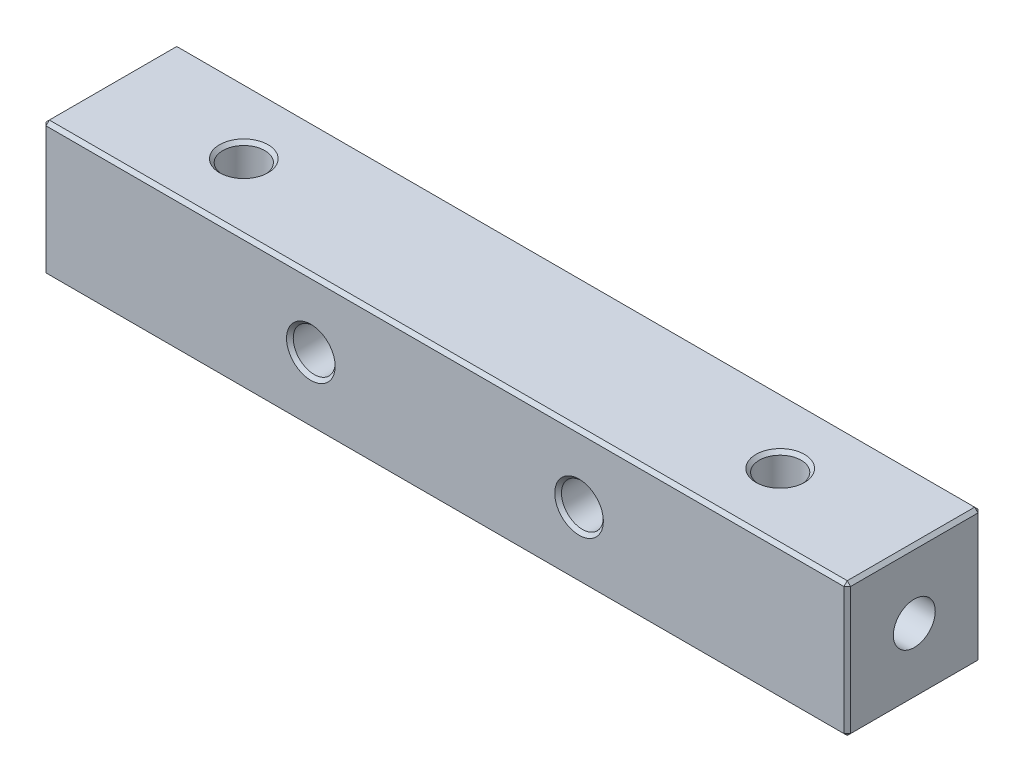
ISO-10303-21;
HEADER;
FILE_DESCRIPTION(('STEP AP214'),'2;1');
FILE_NAME('part.step','',(''),(''),'','','');
FILE_SCHEMA(('AUTOMOTIVE_DESIGN { 1 0 10303 214 1 1 1 1 }'));
ENDSEC;
DATA;
#1=APPLICATION_CONTEXT('core data for automotive mechanical design processes');
#2=APPLICATION_PROTOCOL_DEFINITION('international standard','automotive_design',2000,#1);
#3=PRODUCT_CONTEXT('',#1,'mechanical');
#4=PRODUCT('Part','Part','',(#3));
#5=PRODUCT_RELATED_PRODUCT_CATEGORY('part','',(#4));
#6=PRODUCT_DEFINITION_FORMATION('','',#4);
#7=PRODUCT_DEFINITION_CONTEXT('part definition',#1,'design');
#8=PRODUCT_DEFINITION('design','',#6,#7);
#9=PRODUCT_DEFINITION_SHAPE('','',#8);
#10=(LENGTH_UNIT() NAMED_UNIT(*) SI_UNIT(.MILLI.,.METRE.));
#11=(NAMED_UNIT(*) PLANE_ANGLE_UNIT() SI_UNIT($,.RADIAN.));
#12=(NAMED_UNIT(*) SI_UNIT($,.STERADIAN.) SOLID_ANGLE_UNIT());
#13=UNCERTAINTY_MEASURE_WITH_UNIT(LENGTH_MEASURE(1.E-05),#10,'distance_accuracy_value','');
#14=(GEOMETRIC_REPRESENTATION_CONTEXT(3) GLOBAL_UNCERTAINTY_ASSIGNED_CONTEXT((#13)) GLOBAL_UNIT_ASSIGNED_CONTEXT((#10,
#11,#12)) REPRESENTATION_CONTEXT('',''));
#15=CARTESIAN_POINT('',(0.,0.,0.));
#16=DIRECTION('',(0.,0.,1.));
#17=DIRECTION('',(1.,0.,0.));
#18=AXIS2_PLACEMENT_3D('',#15,#16,#17);
#19=CARTESIAN_POINT('',(-24.,4.,-4.));
#20=DIRECTION('',(1.,0.,0.));
#21=DIRECTION('',(0.,0.,-1.));
#22=AXIS2_PLACEMENT_3D('',#19,#20,#21);
#23=PLANE('',#22);
#24=DIRECTION('',(0.,-1.,0.));
#25=VECTOR('',#24,1.);
#26=CARTESIAN_POINT('',(-24.,4.,-3.79999999999999));
#27=LINE('',#26,#25);
#28=CARTESIAN_POINT('',(-24.,3.79999999999999,-3.79999999999999));
#29=VERTEX_POINT('',#28);
#30=CARTESIAN_POINT('',(-24.,-3.79999999999999,-3.79999999999999));
#31=VERTEX_POINT('',#30);
#32=EDGE_CURVE('E208',#29,#31,#27,.T.);
#33=ORIENTED_EDGE('',*,*,#32,.T.);
#34=DIRECTION('',(0.,0.,1.));
#35=VECTOR('',#34,1.);
#36=CARTESIAN_POINT('',(-24.,-3.79999999999999,-4.));
#37=LINE('',#36,#35);
#38=CARTESIAN_POINT('',(-24.,-3.79999999999999,3.79999999999999));
#39=VERTEX_POINT('',#38);
#40=EDGE_CURVE('E214',#31,#39,#37,.T.);
#41=ORIENTED_EDGE('',*,*,#40,.T.);
#42=DIRECTION('',(0.,1.,0.));
#43=VECTOR('',#42,1.);
#44=CARTESIAN_POINT('',(-24.,4.,3.79999999999999));
#45=LINE('',#44,#43);
#46=CARTESIAN_POINT('',(-24.,3.79999999999999,3.79999999999999));
#47=VERTEX_POINT('',#46);
#48=EDGE_CURVE('E212',#39,#47,#45,.T.);
#49=ORIENTED_EDGE('',*,*,#48,.T.);
#50=DIRECTION('',(0.,0.,-1.));
#51=VECTOR('',#50,1.);
#52=CARTESIAN_POINT('',(-24.,3.79999999999999,-4.));
#53=LINE('',#52,#51);
#54=EDGE_CURVE('E210',#47,#29,#53,.T.);
#55=ORIENTED_EDGE('',*,*,#54,.T.);
#56=EDGE_LOOP('',(#33,#41,#49,#55));
#57=FACE_BOUND('',#56,.T.);
#58=CARTESIAN_POINT('',(-24.,0.,0.));
#59=DIRECTION('',(-1.,0.,0.));
#60=DIRECTION('',(0.,0.,1.));
#61=AXIS2_PLACEMENT_3D('',#58,#59,#60);
#62=CIRCLE('',#61,1.25);
#63=CARTESIAN_POINT('',(-24.,0.,1.25));
#64=VERTEX_POINT('',#63);
#65=EDGE_CURVE('E245',#64,#64,#62,.T.);
#66=ORIENTED_EDGE('',*,*,#65,.F.);
#67=EDGE_LOOP('',(#66));
#68=FACE_BOUND('',#67,.T.);
#69=ADVANCED_FACE('F38',(#57,#68),#23,.F.);
#70=CARTESIAN_POINT('',(24.,4.,-4.));
#71=DIRECTION('',(-1.,0.,0.));
#72=DIRECTION('',(0.,0.,1.));
#73=AXIS2_PLACEMENT_3D('',#70,#71,#72);
#74=PLANE('',#73);
#75=CARTESIAN_POINT('',(24.,0.,0.));
#76=DIRECTION('',(1.,0.,0.));
#77=DIRECTION('',(0.,0.,-1.));
#78=AXIS2_PLACEMENT_3D('',#75,#76,#77);
#79=CIRCLE('',#78,1.24999999999999);
#80=CARTESIAN_POINT('',(24.,0.,-1.24999999999999));
#81=VERTEX_POINT('',#80);
#82=EDGE_CURVE('E321',#81,#81,#79,.T.);
#83=ORIENTED_EDGE('',*,*,#82,.F.);
#84=EDGE_LOOP('',(#83));
#85=FACE_BOUND('',#84,.T.);
#86=DIRECTION('',(0.,-1.,0.));
#87=VECTOR('',#86,1.);
#88=CARTESIAN_POINT('',(24.,4.,3.79999999999999));
#89=LINE('',#88,#87);
#90=CARTESIAN_POINT('',(24.,3.79999999999999,3.79999999999999));
#91=VERTEX_POINT('',#90);
#92=CARTESIAN_POINT('',(24.,-3.79999999999999,3.79999999999999));
#93=VERTEX_POINT('',#92);
#94=EDGE_CURVE('E221',#91,#93,#89,.T.);
#95=ORIENTED_EDGE('',*,*,#94,.T.);
#96=DIRECTION('',(0.,0.,-1.));
#97=VECTOR('',#96,1.);
#98=CARTESIAN_POINT('',(24.,-3.79999999999999,-4.));
#99=LINE('',#98,#97);
#100=CARTESIAN_POINT('',(24.,-3.79999999999999,-3.79999999999999));
#101=VERTEX_POINT('',#100);
#102=EDGE_CURVE('E223',#93,#101,#99,.T.);
#103=ORIENTED_EDGE('',*,*,#102,.T.);
#104=DIRECTION('',(0.,1.,0.));
#105=VECTOR('',#104,1.);
#106=CARTESIAN_POINT('',(24.,4.,-3.79999999999999));
#107=LINE('',#106,#105);
#108=CARTESIAN_POINT('',(24.,3.79999999999999,-3.79999999999999));
#109=VERTEX_POINT('',#108);
#110=EDGE_CURVE('E217',#101,#109,#107,.T.);
#111=ORIENTED_EDGE('',*,*,#110,.T.);
#112=DIRECTION('',(0.,0.,1.));
#113=VECTOR('',#112,1.);
#114=CARTESIAN_POINT('',(24.,3.79999999999999,4.));
#115=LINE('',#114,#113);
#116=EDGE_CURVE('E219',#109,#91,#115,.T.);
#117=ORIENTED_EDGE('',*,*,#116,.T.);
#118=EDGE_LOOP('',(#95,#103,#111,#117));
#119=FACE_BOUND('',#118,.T.);
#120=ADVANCED_FACE('F357',(#85,#119),#74,.F.);
#121=CARTESIAN_POINT('',(-24.,4.,-4.));
#122=DIRECTION('',(0.,0.,1.));
#123=DIRECTION('',(1.,0.,0.));
#124=AXIS2_PLACEMENT_3D('',#121,#122,#123);
#125=PLANE('',#124);
#126=DIRECTION('',(1.,0.,0.));
#127=VECTOR('',#126,1.);
#128=CARTESIAN_POINT('',(24.,3.79999999999999,-4.));
#129=LINE('',#128,#127);
#130=CARTESIAN_POINT('',(-23.8,3.79999999999999,-4.));
#131=VERTEX_POINT('',#130);
#132=CARTESIAN_POINT('',(23.8,3.79999999999999,-4.));
#133=VERTEX_POINT('',#132);
#134=EDGE_CURVE('E236',#131,#133,#129,.T.);
#135=ORIENTED_EDGE('',*,*,#134,.T.);
#136=DIRECTION('',(0.,-1.,0.));
#137=VECTOR('',#136,1.);
#138=CARTESIAN_POINT('',(23.8,4.,-4.));
#139=LINE('',#138,#137);
#140=CARTESIAN_POINT('',(23.8,-3.79999999999999,-4.));
#141=VERTEX_POINT('',#140);
#142=EDGE_CURVE('E238',#133,#141,#139,.T.);
#143=ORIENTED_EDGE('',*,*,#142,.T.);
#144=DIRECTION('',(-1.,0.,0.));
#145=VECTOR('',#144,1.);
#146=CARTESIAN_POINT('',(-24.,-3.79999999999999,-4.));
#147=LINE('',#146,#145);
#148=CARTESIAN_POINT('',(-23.8,-3.79999999999999,-4.));
#149=VERTEX_POINT('',#148);
#150=EDGE_CURVE('E232',#141,#149,#147,.T.);
#151=ORIENTED_EDGE('',*,*,#150,.T.);
#152=DIRECTION('',(0.,1.,0.));
#153=VECTOR('',#152,1.);
#154=CARTESIAN_POINT('',(-23.8,4.,-4.));
#155=LINE('',#154,#153);
#156=EDGE_CURVE('E234',#149,#131,#155,.T.);
#157=ORIENTED_EDGE('',*,*,#156,.T.);
#158=EDGE_LOOP('',(#135,#143,#151,#157));
#159=FACE_BOUND('',#158,.T.);
#160=CARTESIAN_POINT('',(-8.,0.,-4.));
#161=DIRECTION('',(0.,0.,1.));
#162=DIRECTION('',(1.,0.,0.));
#163=AXIS2_PLACEMENT_3D('',#160,#161,#162);
#164=CIRCLE('',#163,1.44999999999997);
#165=CARTESIAN_POINT('',(-6.55000000000003,0.,-4.));
#166=VERTEX_POINT('',#165);
#167=EDGE_CURVE('E229',#166,#166,#164,.T.);
#168=ORIENTED_EDGE('',*,*,#167,.T.);
#169=EDGE_LOOP('',(#168));
#170=FACE_BOUND('',#169,.T.);
#171=CARTESIAN_POINT('',(8.,0.,-4.));
#172=DIRECTION('',(0.,0.,1.));
#173=DIRECTION('',(1.,0.,0.));
#174=AXIS2_PLACEMENT_3D('',#171,#172,#173);
#175=CIRCLE('',#174,1.44999999999997);
#176=CARTESIAN_POINT('',(9.44999999999997,0.,-4.));
#177=VERTEX_POINT('',#176);
#178=EDGE_CURVE('E226',#177,#177,#175,.T.);
#179=ORIENTED_EDGE('',*,*,#178,.T.);
#180=EDGE_LOOP('',(#179));
#181=FACE_BOUND('',#180,.T.);
#182=ADVANCED_FACE('F363',(#159,#170,#181),#125,.F.);
#183=CARTESIAN_POINT('',(-24.,4.,4.));
#184=DIRECTION('',(0.,0.,-1.));
#185=DIRECTION('',(-1.,0.,0.));
#186=AXIS2_PLACEMENT_3D('',#183,#184,#185);
#187=PLANE('',#186);
#188=CARTESIAN_POINT('',(-8.,0.,4.));
#189=DIRECTION('',(0.,0.,-1.));
#190=DIRECTION('',(-1.,0.,0.));
#191=AXIS2_PLACEMENT_3D('',#188,#189,#190);
#192=CIRCLE('',#191,1.45);
#193=CARTESIAN_POINT('',(-9.45,0.,4.));
#194=VERTEX_POINT('',#193);
#195=EDGE_CURVE('E178',#194,#194,#192,.T.);
#196=ORIENTED_EDGE('',*,*,#195,.T.);
#197=EDGE_LOOP('',(#196));
#198=FACE_BOUND('',#197,.T.);
#199=CARTESIAN_POINT('',(8.,0.,4.));
#200=DIRECTION('',(0.,0.,-1.));
#201=DIRECTION('',(-1.,0.,0.));
#202=AXIS2_PLACEMENT_3D('',#199,#200,#201);
#203=CIRCLE('',#202,1.45);
#204=CARTESIAN_POINT('',(9.45,0.,4.));
#205=VERTEX_POINT('',#204);
#206=EDGE_CURVE('E175',#205,#205,#203,.T.);
#207=ORIENTED_EDGE('',*,*,#206,.T.);
#208=EDGE_LOOP('',(#207));
#209=FACE_BOUND('',#208,.T.);
#210=DIRECTION('',(-1.,0.,0.));
#211=VECTOR('',#210,1.);
#212=CARTESIAN_POINT('',(-24.,3.79999999999999,4.));
#213=LINE('',#212,#211);
#214=CARTESIAN_POINT('',(23.8,3.79999999999999,4.));
#215=VERTEX_POINT('',#214);
#216=CARTESIAN_POINT('',(-23.8,3.79999999999999,4.));
#217=VERTEX_POINT('',#216);
#218=EDGE_CURVE('E166',#215,#217,#213,.T.);
#219=ORIENTED_EDGE('',*,*,#218,.T.);
#220=DIRECTION('',(0.,-1.,0.));
#221=VECTOR('',#220,1.);
#222=CARTESIAN_POINT('',(-23.8,4.,4.));
#223=LINE('',#222,#221);
#224=CARTESIAN_POINT('',(-23.8,-3.79999999999999,4.));
#225=VERTEX_POINT('',#224);
#226=EDGE_CURVE('E172',#217,#225,#223,.T.);
#227=ORIENTED_EDGE('',*,*,#226,.T.);
#228=DIRECTION('',(1.,0.,0.));
#229=VECTOR('',#228,1.);
#230=CARTESIAN_POINT('',(-24.,-3.79999999999999,4.));
#231=LINE('',#230,#229);
#232=CARTESIAN_POINT('',(23.8,-3.79999999999999,4.));
#233=VERTEX_POINT('',#232);
#234=EDGE_CURVE('E170',#225,#233,#231,.T.);
#235=ORIENTED_EDGE('',*,*,#234,.T.);
#236=DIRECTION('',(0.,1.,0.));
#237=VECTOR('',#236,1.);
#238=CARTESIAN_POINT('',(23.8,4.,4.));
#239=LINE('',#238,#237);
#240=EDGE_CURVE('E168',#233,#215,#239,.T.);
#241=ORIENTED_EDGE('',*,*,#240,.T.);
#242=EDGE_LOOP('',(#219,#227,#235,#241));
#243=FACE_BOUND('',#242,.T.);
#244=ADVANCED_FACE('F368',(#198,#209,#243),#187,.F.);
#245=CARTESIAN_POINT('',(0.,4.,0.));
#246=DIRECTION('',(0.,1.,0.));
#247=DIRECTION('',(0.,0.,1.));
#248=AXIS2_PLACEMENT_3D('',#245,#246,#247);
#249=PLANE('',#248);
#250=CARTESIAN_POINT('',(16.,4.,0.));
#251=DIRECTION('',(0.,1.,0.));
#252=DIRECTION('',(0.,0.,1.));
#253=AXIS2_PLACEMENT_3D('',#250,#251,#252);
#254=CIRCLE('',#253,1.44999999999997);
#255=CARTESIAN_POINT('',(16.,4.,1.44999999999997));
#256=VERTEX_POINT('',#255);
#257=EDGE_CURVE('E205',#256,#256,#254,.F.);
#258=ORIENTED_EDGE('',*,*,#257,.T.);
#259=EDGE_LOOP('',(#258));
#260=FACE_BOUND('',#259,.T.);
#261=CARTESIAN_POINT('',(-16.,4.,0.));
#262=DIRECTION('',(0.,1.,0.));
#263=DIRECTION('',(0.,0.,1.));
#264=AXIS2_PLACEMENT_3D('',#261,#262,#263);
#265=CIRCLE('',#264,1.44999999999997);
#266=CARTESIAN_POINT('',(-16.,4.,1.44999999999997));
#267=VERTEX_POINT('',#266);
#268=EDGE_CURVE('E202',#267,#267,#265,.F.);
#269=ORIENTED_EDGE('',*,*,#268,.T.);
#270=EDGE_LOOP('',(#269));
#271=FACE_BOUND('',#270,.T.);
#272=DIRECTION('',(0.,0.,1.));
#273=VECTOR('',#272,1.);
#274=CARTESIAN_POINT('',(-23.8,4.,4.));
#275=LINE('',#274,#273);
#276=CARTESIAN_POINT('',(-23.8,4.,-3.79999999999999));
#277=VERTEX_POINT('',#276);
#278=CARTESIAN_POINT('',(-23.8,4.,3.79999999999999));
#279=VERTEX_POINT('',#278);
#280=EDGE_CURVE('E197',#277,#279,#275,.T.);
#281=ORIENTED_EDGE('',*,*,#280,.T.);
#282=DIRECTION('',(1.,0.,0.));
#283=VECTOR('',#282,1.);
#284=CARTESIAN_POINT('',(24.,4.,3.79999999999999));
#285=LINE('',#284,#283);
#286=CARTESIAN_POINT('',(23.8,4.,3.79999999999999));
#287=VERTEX_POINT('',#286);
#288=EDGE_CURVE('E199',#279,#287,#285,.T.);
#289=ORIENTED_EDGE('',*,*,#288,.T.);
#290=DIRECTION('',(0.,0.,-1.));
#291=VECTOR('',#290,1.);
#292=CARTESIAN_POINT('',(23.8,4.,-4.));
#293=LINE('',#292,#291);
#294=CARTESIAN_POINT('',(23.8,4.,-3.79999999999999));
#295=VERTEX_POINT('',#294);
#296=EDGE_CURVE('E195',#287,#295,#293,.T.);
#297=ORIENTED_EDGE('',*,*,#296,.T.);
#298=DIRECTION('',(-1.,0.,0.));
#299=VECTOR('',#298,1.);
#300=CARTESIAN_POINT('',(-24.,4.,-3.79999999999999));
#301=LINE('',#300,#299);
#302=EDGE_CURVE('E193',#295,#277,#301,.T.);
#303=ORIENTED_EDGE('',*,*,#302,.T.);
#304=EDGE_LOOP('',(#281,#289,#297,#303));
#305=FACE_BOUND('',#304,.T.);
#306=ADVANCED_FACE('F524',(#260,#271,#305),#249,.T.);
#307=CARTESIAN_POINT('',(0.,-4.,0.));
#308=DIRECTION('',(0.,1.,0.));
#309=DIRECTION('',(0.,0.,1.));
#310=AXIS2_PLACEMENT_3D('',#307,#308,#309);
#311=PLANE('',#310);
#312=CARTESIAN_POINT('',(16.,-4.,0.));
#313=DIRECTION('',(0.,1.,0.));
#314=DIRECTION('',(0.,0.,1.));
#315=AXIS2_PLACEMENT_3D('',#312,#313,#314);
#316=CIRCLE('',#315,1.45);
#317=CARTESIAN_POINT('',(16.,-4.,1.45));
#318=VERTEX_POINT('',#317);
#319=EDGE_CURVE('E152',#318,#318,#316,.T.);
#320=ORIENTED_EDGE('',*,*,#319,.T.);
#321=EDGE_LOOP('',(#320));
#322=FACE_BOUND('',#321,.T.);
#323=CARTESIAN_POINT('',(-16.,-4.,0.));
#324=DIRECTION('',(0.,1.,0.));
#325=DIRECTION('',(0.,0.,1.));
#326=AXIS2_PLACEMENT_3D('',#323,#324,#325);
#327=CIRCLE('',#326,1.45);
#328=CARTESIAN_POINT('',(-16.,-4.,1.45));
#329=VERTEX_POINT('',#328);
#330=EDGE_CURVE('E157',#329,#329,#327,.T.);
#331=ORIENTED_EDGE('',*,*,#330,.T.);
#332=EDGE_LOOP('',(#331));
#333=FACE_BOUND('',#332,.T.);
#334=DIRECTION('',(0.,0.,1.));
#335=VECTOR('',#334,1.);
#336=CARTESIAN_POINT('',(23.8,-4.,0.));
#337=LINE('',#336,#335);
#338=CARTESIAN_POINT('',(23.8,-4.,-3.79999999999999));
#339=VERTEX_POINT('',#338);
#340=CARTESIAN_POINT('',(23.8,-4.,3.79999999999999));
#341=VERTEX_POINT('',#340);
#342=EDGE_CURVE('E327',#339,#341,#337,.T.);
#343=ORIENTED_EDGE('',*,*,#342,.T.);
#344=DIRECTION('',(-1.,0.,0.));
#345=VECTOR('',#344,1.);
#346=CARTESIAN_POINT('',(0.,-4.,3.79999999999999));
#347=LINE('',#346,#345);
#348=CARTESIAN_POINT('',(-23.8,-4.,3.79999999999999));
#349=VERTEX_POINT('',#348);
#350=EDGE_CURVE('E332',#341,#349,#347,.T.);
#351=ORIENTED_EDGE('',*,*,#350,.T.);
#352=DIRECTION('',(0.,0.,-1.));
#353=VECTOR('',#352,1.);
#354=CARTESIAN_POINT('',(-23.8,-4.,0.));
#355=LINE('',#354,#353);
#356=CARTESIAN_POINT('',(-23.8,-4.,-3.79999999999999));
#357=VERTEX_POINT('',#356);
#358=EDGE_CURVE('E329',#349,#357,#355,.T.);
#359=ORIENTED_EDGE('',*,*,#358,.T.);
#360=DIRECTION('',(1.,0.,0.));
#361=VECTOR('',#360,1.);
#362=CARTESIAN_POINT('',(0.,-4.,-3.79999999999999));
#363=LINE('',#362,#361);
#364=EDGE_CURVE('E310',#357,#339,#363,.T.);
#365=ORIENTED_EDGE('',*,*,#364,.T.);
#366=EDGE_LOOP('',(#343,#351,#359,#365));
#367=FACE_BOUND('',#366,.T.);
#368=ADVANCED_FACE('F142',(#322,#333,#367),#311,.F.);
#369=CARTESIAN_POINT('',(16.,4.,0.));
#370=DIRECTION('',(0.,1.,0.));
#371=DIRECTION('',(0.,0.,1.));
#372=AXIS2_PLACEMENT_3D('',#369,#370,#371);
#373=CYLINDRICAL_SURFACE('',#372,1.24999999999999);
#374=CARTESIAN_POINT('',(16.,0.,0.));
#375=DIRECTION('',(-0.707106781186547,0.707106781186547,0.));
#376=DIRECTION('',(0.707106781186547,0.707106781186547,0.));
#377=AXIS2_PLACEMENT_3D('',#374,#375,#376);
#378=ELLIPSE('',#377,1.76776695296636,1.24999999999999);
#379=CARTESIAN_POINT('',(16.,0.,-1.25));
#380=VERTEX_POINT('',#379);
#381=CARTESIAN_POINT('',(16.,0.,1.24999999999999));
#382=VERTEX_POINT('',#381);
#383=EDGE_CURVE('E47',#380,#382,#378,.F.);
#384=ORIENTED_EDGE('',*,*,#383,.T.);
#385=CARTESIAN_POINT('',(16.,0.,0.));
#386=DIRECTION('',(0.707106781186547,0.707106781186547,0.));
#387=DIRECTION('',(-0.707106781186547,0.707106781186547,0.));
#388=AXIS2_PLACEMENT_3D('',#385,#386,#387);
#389=ELLIPSE('',#388,1.76776695296636,1.24999999999999);
#390=EDGE_CURVE('E11',#382,#380,#389,.T.);
#391=ORIENTED_EDGE('',*,*,#390,.T.);
#392=EDGE_LOOP('',(#384,#391));
#393=FACE_BOUND('',#392,.T.);
#394=CARTESIAN_POINT('',(16.,-3.8,0.));
#395=DIRECTION('',(0.,1.,0.));
#396=DIRECTION('',(0.,0.,1.));
#397=AXIS2_PLACEMENT_3D('',#394,#395,#396);
#398=CIRCLE('',#397,1.24999999999999);
#399=CARTESIAN_POINT('',(16.,-3.8,1.24999999999999));
#400=VERTEX_POINT('',#399);
#401=EDGE_CURVE('E147',#400,#400,#398,.F.);
#402=ORIENTED_EDGE('',*,*,#401,.T.);
#403=EDGE_LOOP('',(#402));
#404=FACE_BOUND('',#403,.T.);
#405=CARTESIAN_POINT('',(16.,3.80000000000002,0.));
#406=DIRECTION('',(0.,1.,0.));
#407=DIRECTION('',(0.,0.,1.));
#408=AXIS2_PLACEMENT_3D('',#405,#406,#407);
#409=CIRCLE('',#408,1.24999999999999);
#410=CARTESIAN_POINT('',(16.,3.80000000000002,1.24999999999999));
#411=VERTEX_POINT('',#410);
#412=EDGE_CURVE('E150',#411,#411,#409,.T.);
#413=ORIENTED_EDGE('',*,*,#412,.T.);
#414=EDGE_LOOP('',(#413));
#415=FACE_BOUND('',#414,.T.);
#416=ADVANCED_FACE('F138',(#393,#404,#415),#373,.F.);
#417=CARTESIAN_POINT('',(-16.,4.,0.));
#418=DIRECTION('',(0.,1.,0.));
#419=DIRECTION('',(0.,0.,1.));
#420=AXIS2_PLACEMENT_3D('',#417,#418,#419);
#421=CYLINDRICAL_SURFACE('',#420,1.24999999999999);
#422=CARTESIAN_POINT('',(-16.,0.,0.));
#423=DIRECTION('',(0.707106781186547,0.707106781186547,0.));
#424=DIRECTION('',(-0.707106781186547,0.707106781186547,0.));
#425=AXIS2_PLACEMENT_3D('',#422,#423,#424);
#426=ELLIPSE('',#425,1.76776695296636,1.25);
#427=CARTESIAN_POINT('',(-16.,0.,1.25));
#428=VERTEX_POINT('',#427);
#429=CARTESIAN_POINT('',(-16.,0.,-1.24999999999999));
#430=VERTEX_POINT('',#429);
#431=EDGE_CURVE('E241',#428,#430,#426,.F.);
#432=ORIENTED_EDGE('',*,*,#431,.T.);
#433=CARTESIAN_POINT('',(-16.,0.,0.));
#434=DIRECTION('',(-0.707106781186547,0.707106781186547,0.));
#435=DIRECTION('',(0.707106781186547,0.707106781186547,0.));
#436=AXIS2_PLACEMENT_3D('',#433,#434,#435);
#437=ELLIPSE('',#436,1.76776695296636,1.25);
#438=EDGE_CURVE('E58',#430,#428,#437,.T.);
#439=ORIENTED_EDGE('',*,*,#438,.T.);
#440=EDGE_LOOP('',(#432,#439));
#441=FACE_BOUND('',#440,.T.);
#442=CARTESIAN_POINT('',(-16.,-3.8,0.));
#443=DIRECTION('',(0.,1.,0.));
#444=DIRECTION('',(0.,0.,1.));
#445=AXIS2_PLACEMENT_3D('',#442,#443,#444);
#446=CIRCLE('',#445,1.24999999999999);
#447=CARTESIAN_POINT('',(-16.,-3.8,1.24999999999999));
#448=VERTEX_POINT('',#447);
#449=EDGE_CURVE('E163',#448,#448,#446,.F.);
#450=ORIENTED_EDGE('',*,*,#449,.T.);
#451=EDGE_LOOP('',(#450));
#452=FACE_BOUND('',#451,.T.);
#453=CARTESIAN_POINT('',(-16.,3.80000000000002,0.));
#454=DIRECTION('',(0.,1.,0.));
#455=DIRECTION('',(0.,0.,1.));
#456=AXIS2_PLACEMENT_3D('',#453,#454,#455);
#457=CIRCLE('',#456,1.24999999999999);
#458=CARTESIAN_POINT('',(-16.,3.80000000000002,1.24999999999999));
#459=VERTEX_POINT('',#458);
#460=EDGE_CURVE('E154',#459,#459,#457,.T.);
#461=ORIENTED_EDGE('',*,*,#460,.T.);
#462=EDGE_LOOP('',(#461));
#463=FACE_BOUND('',#462,.T.);
#464=ADVANCED_FACE('F141',(#441,#452,#463),#421,.F.);
#465=CARTESIAN_POINT('',(-8.,0.,-4.));
#466=DIRECTION('',(0.,0.,-1.));
#467=DIRECTION('',(-1.,0.,0.));
#468=AXIS2_PLACEMENT_3D('',#465,#466,#467);
#469=CYLINDRICAL_SURFACE('',#468,1.24999999999999);
#470=CARTESIAN_POINT('',(-8.,0.,3.79999999999999));
#471=DIRECTION('',(0.,0.,-1.));
#472=DIRECTION('',(-1.,0.,0.));
#473=AXIS2_PLACEMENT_3D('',#470,#471,#472);
#474=CIRCLE('',#473,1.24999999999999);
#475=CARTESIAN_POINT('',(-9.24999999999999,0.,3.79999999999999));
#476=VERTEX_POINT('',#475);
#477=EDGE_CURVE('E184',#476,#476,#474,.F.);
#478=ORIENTED_EDGE('',*,*,#477,.T.);
#479=EDGE_LOOP('',(#478));
#480=FACE_BOUND('',#479,.T.);
#481=CARTESIAN_POINT('',(-8.,0.,-3.80000000000002));
#482=DIRECTION('',(0.,0.,1.));
#483=DIRECTION('',(1.,0.,0.));
#484=AXIS2_PLACEMENT_3D('',#481,#482,#483);
#485=CIRCLE('',#484,1.24999999999999);
#486=CARTESIAN_POINT('',(-6.75000000000001,0.,-3.80000000000002));
#487=VERTEX_POINT('',#486);
#488=EDGE_CURVE('E181',#487,#487,#485,.F.);
#489=ORIENTED_EDGE('',*,*,#488,.T.);
#490=EDGE_LOOP('',(#489));
#491=FACE_BOUND('',#490,.T.);
#492=ADVANCED_FACE('F512',(#480,#491),#469,.F.);
#493=CARTESIAN_POINT('',(8.,0.,-4.));
#494=DIRECTION('',(0.,0.,-1.));
#495=DIRECTION('',(-1.,0.,0.));
#496=AXIS2_PLACEMENT_3D('',#493,#494,#495);
#497=CYLINDRICAL_SURFACE('',#496,1.24999999999999);
#498=CARTESIAN_POINT('',(8.,0.,3.8));
#499=DIRECTION('',(0.,0.,-1.));
#500=DIRECTION('',(-1.,0.,0.));
#501=AXIS2_PLACEMENT_3D('',#498,#499,#500);
#502=CIRCLE('',#501,1.24999999999999);
#503=CARTESIAN_POINT('',(9.24999999999999,0.,3.8));
#504=VERTEX_POINT('',#503);
#505=EDGE_CURVE('E190',#504,#504,#502,.F.);
#506=ORIENTED_EDGE('',*,*,#505,.T.);
#507=EDGE_LOOP('',(#506));
#508=FACE_BOUND('',#507,.T.);
#509=CARTESIAN_POINT('',(8.,0.,-3.80000000000002));
#510=DIRECTION('',(0.,0.,1.));
#511=DIRECTION('',(1.,0.,0.));
#512=AXIS2_PLACEMENT_3D('',#509,#510,#511);
#513=CIRCLE('',#512,1.24999999999999);
#514=CARTESIAN_POINT('',(9.24999999999999,0.,-3.80000000000002));
#515=VERTEX_POINT('',#514);
#516=EDGE_CURVE('E187',#515,#515,#513,.F.);
#517=ORIENTED_EDGE('',*,*,#516,.T.);
#518=EDGE_LOOP('',(#517));
#519=FACE_BOUND('',#518,.T.);
#520=ADVANCED_FACE('F351',(#508,#519),#497,.F.);
#521=CARTESIAN_POINT('',(16.,-4.,0.));
#522=DIRECTION('',(0.,-1.,0.));
#523=DIRECTION('',(0.,0.,-1.));
#524=AXIS2_PLACEMENT_3D('',#521,#522,#523);
#525=CONICAL_SURFACE('',#524,1.45,0.785398163397457);
#526=ORIENTED_EDGE('',*,*,#401,.F.);
#527=EDGE_LOOP('',(#526));
#528=FACE_BOUND('',#527,.T.);
#529=ORIENTED_EDGE('',*,*,#319,.F.);
#530=EDGE_LOOP('',(#529));
#531=FACE_BOUND('',#530,.T.);
#532=ADVANCED_FACE('F341',(#528,#531),#525,.F.);
#533=CARTESIAN_POINT('',(-16.,-4.,0.));
#534=DIRECTION('',(0.,-1.,0.));
#535=DIRECTION('',(0.,0.,-1.));
#536=AXIS2_PLACEMENT_3D('',#533,#534,#535);
#537=CONICAL_SURFACE('',#536,1.45,0.785398163397457);
#538=ORIENTED_EDGE('',*,*,#449,.F.);
#539=EDGE_LOOP('',(#538));
#540=FACE_BOUND('',#539,.T.);
#541=ORIENTED_EDGE('',*,*,#330,.F.);
#542=EDGE_LOOP('',(#541));
#543=FACE_BOUND('',#542,.T.);
#544=ADVANCED_FACE('F338',(#540,#543),#537,.F.);
#545=CARTESIAN_POINT('',(-8.,0.,4.));
#546=DIRECTION('',(0.,0.,1.));
#547=DIRECTION('',(1.,0.,0.));
#548=AXIS2_PLACEMENT_3D('',#545,#546,#547);
#549=CONICAL_SURFACE('',#548,1.45,0.785398163397431);
#550=ORIENTED_EDGE('',*,*,#477,.F.);
#551=EDGE_LOOP('',(#550));
#552=FACE_BOUND('',#551,.T.);
#553=ORIENTED_EDGE('',*,*,#195,.F.);
#554=EDGE_LOOP('',(#553));
#555=FACE_BOUND('',#554,.T.);
#556=ADVANCED_FACE('F340',(#552,#555),#549,.F.);
#557=CARTESIAN_POINT('',(8.,0.,4.));
#558=DIRECTION('',(0.,0.,1.));
#559=DIRECTION('',(1.,0.,0.));
#560=AXIS2_PLACEMENT_3D('',#557,#558,#559);
#561=CONICAL_SURFACE('',#560,1.45,0.785398163397455);
#562=CARTESIAN_POINT('',(9.24999999999999,0.,3.8));
#563=CARTESIAN_POINT('',(9.25208333333333,0.,3.80208333333333));
#564=CARTESIAN_POINT('',(9.25416666666666,0.,3.80416666666666));
#565=CARTESIAN_POINT('',(9.25833333333333,0.,3.80833333333333));
#566=CARTESIAN_POINT('',(9.26041666666666,0.,3.81041666666666));
#567=CARTESIAN_POINT('',(9.26458333333333,0.,3.81458333333333));
#568=CARTESIAN_POINT('',(9.26666666666666,0.,3.81666666666666));
#569=CARTESIAN_POINT('',(9.27083333333333,0.,3.82083333333333));
#570=CARTESIAN_POINT('',(9.27291666666666,0.,3.82291666666666));
#571=CARTESIAN_POINT('',(9.27708333333333,0.,3.82708333333333));
#572=CARTESIAN_POINT('',(9.27916666666666,0.,3.82916666666666));
#573=CARTESIAN_POINT('',(9.28333333333333,0.,3.83333333333333));
#574=CARTESIAN_POINT('',(9.28541666666666,0.,3.83541666666666));
#575=CARTESIAN_POINT('',(9.28958333333333,0.,3.83958333333333));
#576=CARTESIAN_POINT('',(9.29166666666666,0.,3.84166666666666));
#577=CARTESIAN_POINT('',(9.29583333333333,0.,3.84583333333333));
#578=CARTESIAN_POINT('',(9.29791666666666,0.,3.84791666666666));
#579=CARTESIAN_POINT('',(9.30208333333333,0.,3.85208333333333));
#580=CARTESIAN_POINT('',(9.30416666666666,0.,3.85416666666666));
#581=CARTESIAN_POINT('',(9.30833333333333,0.,3.85833333333333));
#582=CARTESIAN_POINT('',(9.31041666666666,0.,3.86041666666666));
#583=CARTESIAN_POINT('',(9.31458333333333,0.,3.86458333333333));
#584=CARTESIAN_POINT('',(9.31666666666666,0.,3.86666666666666));
#585=CARTESIAN_POINT('',(9.32083333333333,0.,3.87083333333333));
#586=CARTESIAN_POINT('',(9.32291666666666,0.,3.87291666666666));
#587=CARTESIAN_POINT('',(9.32708333333333,0.,3.87708333333333));
#588=CARTESIAN_POINT('',(9.32916666666666,0.,3.87916666666666));
#589=CARTESIAN_POINT('',(9.33333333333333,0.,3.88333333333333));
#590=CARTESIAN_POINT('',(9.33541666666666,0.,3.88541666666666));
#591=CARTESIAN_POINT('',(9.33958333333333,0.,3.88958333333333));
#592=CARTESIAN_POINT('',(9.34166666666666,0.,3.89166666666666));
#593=CARTESIAN_POINT('',(9.34583333333333,0.,3.89583333333333));
#594=CARTESIAN_POINT('',(9.34791666666666,0.,3.89791666666666));
#595=CARTESIAN_POINT('',(9.35208333333333,0.,3.90208333333333));
#596=CARTESIAN_POINT('',(9.35416666666666,0.,3.90416666666667));
#597=CARTESIAN_POINT('',(9.35833333333333,0.,3.90833333333333));
#598=CARTESIAN_POINT('',(9.36041666666666,0.,3.91041666666666));
#599=CARTESIAN_POINT('',(9.36458333333333,0.,3.91458333333333));
#600=CARTESIAN_POINT('',(9.36666666666666,0.,3.91666666666667));
#601=CARTESIAN_POINT('',(9.37083333333333,0.,3.92083333333333));
#602=CARTESIAN_POINT('',(9.37291666666667,0.,3.92291666666666));
#603=CARTESIAN_POINT('',(9.37708333333333,0.,3.92708333333333));
#604=CARTESIAN_POINT('',(9.37916666666666,0.,3.92916666666667));
#605=CARTESIAN_POINT('',(9.38333333333333,0.,3.93333333333333));
#606=CARTESIAN_POINT('',(9.38541666666666,0.,3.93541666666667));
#607=CARTESIAN_POINT('',(9.38958333333333,0.,3.93958333333333));
#608=CARTESIAN_POINT('',(9.39166666666666,0.,3.94166666666667));
#609=CARTESIAN_POINT('',(9.39583333333333,0.,3.94583333333333));
#610=CARTESIAN_POINT('',(9.39791666666667,0.,3.94791666666667));
#611=CARTESIAN_POINT('',(9.40208333333333,0.,3.95208333333333));
#612=CARTESIAN_POINT('',(9.40416666666667,0.,3.95416666666667));
#613=CARTESIAN_POINT('',(9.40833333333333,0.,3.95833333333333));
#614=CARTESIAN_POINT('',(9.41041666666667,0.,3.96041666666667));
#615=CARTESIAN_POINT('',(9.41458333333333,0.,3.96458333333333));
#616=CARTESIAN_POINT('',(9.41666666666667,0.,3.96666666666667));
#617=CARTESIAN_POINT('',(9.42083333333333,0.,3.97083333333333));
#618=CARTESIAN_POINT('',(9.42291666666667,0.,3.97291666666667));
#619=CARTESIAN_POINT('',(9.42708333333333,0.,3.97708333333333));
#620=CARTESIAN_POINT('',(9.42916666666667,0.,3.97916666666667));
#621=CARTESIAN_POINT('',(9.43333333333333,0.,3.98333333333333));
#622=CARTESIAN_POINT('',(9.43541666666667,0.,3.98541666666667));
#623=CARTESIAN_POINT('',(9.43958333333333,0.,3.98958333333333));
#624=CARTESIAN_POINT('',(9.44166666666667,0.,3.99166666666667));
#625=CARTESIAN_POINT('',(9.44583333333333,0.,3.99583333333333));
#626=CARTESIAN_POINT('',(9.44791666666667,0.,3.99791666666667));
#627=CARTESIAN_POINT('',(9.45,0.,4.));
#628=B_SPLINE_CURVE_WITH_KNOTS('',3,(#562,#563,#564,#565,#566,#567,#568,#569,#570,#571,#572,
#573,#574,#575,#576,#577,#578,#579,#580,#581,#582,#583,#584,#585,#586,#587,#588,#589,#590,#591,
#592,#593,#594,#595,#596,#597,#598,#599,#600,#601,#602,#603,#604,#605,#606,#607,#608,#609,#610,
#611,#612,#613,#614,#615,#616,#617,#618,#619,#620,#621,#622,#623,#624,#625,#626,#627),
.UNSPECIFIED.,.F.,.F.,(4,2,2,2,2,2,2,2,2,2,2,2,2,2,2,2,2,2,2,2,2,2,2,2,2,2,2,2,2,2,2,2,4),(0.,
0.0088388347648324,0.0176776695296639,0.0265165042944966,0.0353553390593281,0.0441941738241608,
0.0530330085889923,0.061871843353825,0.0707106781186565,0.0795495128834892,0.0883883476483207,
0.0972271824131534,0.106066017177986,0.114904851942818,0.12374368670765,0.132582521472482,
0.141421356237314,0.150260191002146,0.159099025766979,0.16793786053181,0.176776695296643,
0.185615530061474,0.194454364826307,0.203293199591139,0.212132034355971,0.220970869120803,
0.229809703885635,0.238648538650468,0.2474873734153,0.256326208180132,0.265165042944964,
0.274003877709797,0.282842712474628),.UNSPECIFIED.);
#629=EDGE_CURVE('BSEAM348',#504,#205,#628,.T.);
#630=ORIENTED_EDGE('',*,*,#505,.F.);
#631=ORIENTED_EDGE('',*,*,#206,.F.);
#632=ORIENTED_EDGE('',*,*,#629,.T.);
#633=ORIENTED_EDGE('',*,*,#629,.F.);
#634=EDGE_LOOP('',(#630,#632,#631,#633));
#635=FACE_BOUND('',#634,.T.);
#636=ADVANCED_FACE('F348',(#635),#561,.F.);
#637=CARTESIAN_POINT('',(16.,3.80000000000002,0.));
#638=DIRECTION('',(0.,1.,0.));
#639=DIRECTION('',(0.,0.,1.));
#640=AXIS2_PLACEMENT_3D('',#637,#638,#639);
#641=CONICAL_SURFACE('',#640,1.24999999999999,0.785398163397448);
#642=ORIENTED_EDGE('',*,*,#257,.F.);
#643=EDGE_LOOP('',(#642));
#644=FACE_BOUND('',#643,.T.);
#645=ORIENTED_EDGE('',*,*,#412,.F.);
#646=EDGE_LOOP('',(#645));
#647=FACE_BOUND('',#646,.T.);
#648=ADVANCED_FACE('F389',(#644,#647),#641,.F.);
#649=CARTESIAN_POINT('',(-16.,3.80000000000002,0.));
#650=DIRECTION('',(0.,1.,0.));
#651=DIRECTION('',(0.,0.,1.));
#652=AXIS2_PLACEMENT_3D('',#649,#650,#651);
#653=CONICAL_SURFACE('',#652,1.24999999999999,0.785398163397448);
#654=ORIENTED_EDGE('',*,*,#268,.F.);
#655=EDGE_LOOP('',(#654));
#656=FACE_BOUND('',#655,.T.);
#657=ORIENTED_EDGE('',*,*,#460,.F.);
#658=EDGE_LOOP('',(#657));
#659=FACE_BOUND('',#658,.T.);
#660=ADVANCED_FACE('F394',(#656,#659),#653,.F.);
#661=CARTESIAN_POINT('',(23.8,4.,0.));
#662=DIRECTION('',(0.707106781186548,0.707106781186548,0.));
#663=DIRECTION('',(0.,0.,1.));
#664=AXIS2_PLACEMENT_3D('',#661,#662,#663);
#665=PLANE('',#664);
#666=DIRECTION('',(0.707106781186548,-0.707106781186548,0.));
#667=VECTOR('',#666,1.);
#668=CARTESIAN_POINT('',(23.8,4.,-3.79999999999999));
#669=LINE('',#668,#667);
#670=EDGE_CURVE('E307',#295,#109,#669,.T.);
#671=ORIENTED_EDGE('',*,*,#670,.F.);
#672=ORIENTED_EDGE('',*,*,#296,.F.);
#673=DIRECTION('',(-0.707106781186548,0.707106781186548,0.));
#674=VECTOR('',#673,1.);
#675=CARTESIAN_POINT('',(23.9,3.9,3.79999999999999));
#676=LINE('',#675,#674);
#677=EDGE_CURVE('E304',#91,#287,#676,.T.);
#678=ORIENTED_EDGE('',*,*,#677,.F.);
#679=ORIENTED_EDGE('',*,*,#116,.F.);
#680=EDGE_LOOP('',(#671,#672,#678,#679));
#681=FACE_BOUND('',#680,.T.);
#682=ADVANCED_FACE('F400',(#681),#665,.T.);
#683=CARTESIAN_POINT('',(23.8,4.,-3.79999999999999));
#684=DIRECTION('',(0.577350269189626,0.577350269189626,-0.577350269189626));
#685=DIRECTION('',(-0.707106781186547,0.,-0.707106781186547));
#686=AXIS2_PLACEMENT_3D('',#683,#684,#685);
#687=PLANE('',#686);
#688=DIRECTION('',(0.,0.707106781186548,0.707106781186548));
#689=VECTOR('',#688,1.);
#690=CARTESIAN_POINT('',(23.8,4.,-3.79999999999999));
#691=LINE('',#690,#689);
#692=EDGE_CURVE('E298',#295,#133,#691,.F.);
#693=ORIENTED_EDGE('',*,*,#692,.F.);
#694=ORIENTED_EDGE('',*,*,#670,.T.);
#695=DIRECTION('',(0.707106781186548,0.,0.707106781186548));
#696=VECTOR('',#695,1.);
#697=CARTESIAN_POINT('',(23.9,3.79999999999999,-3.9));
#698=LINE('',#697,#696);
#699=EDGE_CURVE('E301',#133,#109,#698,.T.);
#700=ORIENTED_EDGE('',*,*,#699,.F.);
#701=EDGE_LOOP('',(#693,#694,#700));
#702=FACE_BOUND('',#701,.T.);
#703=ADVANCED_FACE('F405',(#702),#687,.T.);
#704=CARTESIAN_POINT('',(23.8,3.79999999999999,4.));
#705=DIRECTION('',(0.577350269189626,0.577350269189626,0.577350269189626));
#706=DIRECTION('',(0.707106781186547,0.,-0.707106781186547));
#707=AXIS2_PLACEMENT_3D('',#704,#705,#706);
#708=PLANE('',#707);
#709=DIRECTION('',(-0.707106781186548,0.,0.707106781186548));
#710=VECTOR('',#709,1.);
#711=CARTESIAN_POINT('',(23.8,3.79999999999999,4.));
#712=LINE('',#711,#710);
#713=EDGE_CURVE('E293',#91,#215,#712,.T.);
#714=ORIENTED_EDGE('',*,*,#713,.F.);
#715=ORIENTED_EDGE('',*,*,#677,.T.);
#716=DIRECTION('',(0.,-0.707106781186548,0.707106781186548));
#717=VECTOR('',#716,1.);
#718=CARTESIAN_POINT('',(23.8,3.79999999999999,4.));
#719=LINE('',#718,#717);
#720=EDGE_CURVE('E296',#215,#287,#719,.F.);
#721=ORIENTED_EDGE('',*,*,#720,.F.);
#722=EDGE_LOOP('',(#714,#715,#721));
#723=FACE_BOUND('',#722,.T.);
#724=ADVANCED_FACE('F410',(#723),#708,.T.);
#725=CARTESIAN_POINT('',(23.8,4.,-4.));
#726=DIRECTION('',(-0.707106781186548,0.,0.707106781186548));
#727=DIRECTION('',(0.,-1.,0.));
#728=AXIS2_PLACEMENT_3D('',#725,#726,#727);
#729=PLANE('',#728);
#730=ORIENTED_EDGE('',*,*,#699,.T.);
#731=ORIENTED_EDGE('',*,*,#110,.F.);
#732=DIRECTION('',(-0.707106781186548,0.,-0.707106781186548));
#733=VECTOR('',#732,1.);
#734=CARTESIAN_POINT('',(24.,-3.79999999999999,-3.79999999999999));
#735=LINE('',#734,#733);
#736=EDGE_CURVE('E288',#141,#101,#735,.F.);
#737=ORIENTED_EDGE('',*,*,#736,.F.);
#738=ORIENTED_EDGE('',*,*,#142,.F.);
#739=EDGE_LOOP('',(#730,#731,#737,#738));
#740=FACE_BOUND('',#739,.T.);
#741=ADVANCED_FACE('F415',(#740),#729,.F.);
#742=CARTESIAN_POINT('',(0.,4.,-3.79999999999999));
#743=DIRECTION('',(0.,0.707106781186548,-0.707106781186548));
#744=DIRECTION('',(1.,0.,0.));
#745=AXIS2_PLACEMENT_3D('',#742,#743,#744);
#746=PLANE('',#745);
#747=ORIENTED_EDGE('',*,*,#692,.T.);
#748=ORIENTED_EDGE('',*,*,#134,.F.);
#749=DIRECTION('',(0.,-0.707106781186548,-0.707106781186548));
#750=VECTOR('',#749,1.);
#751=CARTESIAN_POINT('',(-23.8,3.9,-3.9));
#752=LINE('',#751,#750);
#753=EDGE_CURVE('E285',#277,#131,#752,.T.);
#754=ORIENTED_EDGE('',*,*,#753,.F.);
#755=ORIENTED_EDGE('',*,*,#302,.F.);
#756=EDGE_LOOP('',(#747,#748,#754,#755));
#757=FACE_BOUND('',#756,.T.);
#758=ADVANCED_FACE('F420',(#757),#746,.T.);
#759=CARTESIAN_POINT('',(-23.8,4.,0.));
#760=DIRECTION('',(-0.707106781186548,0.707106781186548,0.));
#761=DIRECTION('',(0.,0.,-1.));
#762=AXIS2_PLACEMENT_3D('',#759,#760,#761);
#763=PLANE('',#762);
#764=DIRECTION('',(-0.707106781186548,-0.707106781186548,0.));
#765=VECTOR('',#764,1.);
#766=CARTESIAN_POINT('',(-24.,3.79999999999999,3.79999999999999));
#767=LINE('',#766,#765);
#768=EDGE_CURVE('E279',#279,#47,#767,.T.);
#769=ORIENTED_EDGE('',*,*,#768,.F.);
#770=ORIENTED_EDGE('',*,*,#280,.F.);
#771=DIRECTION('',(0.707106781186548,0.707106781186548,0.));
#772=VECTOR('',#771,1.);
#773=CARTESIAN_POINT('',(-24.,3.79999999999999,-3.79999999999999));
#774=LINE('',#773,#772);
#775=EDGE_CURVE('E282',#29,#277,#774,.T.);
#776=ORIENTED_EDGE('',*,*,#775,.F.);
#777=ORIENTED_EDGE('',*,*,#54,.F.);
#778=EDGE_LOOP('',(#769,#770,#776,#777));
#779=FACE_BOUND('',#778,.T.);
#780=ADVANCED_FACE('F425',(#779),#763,.T.);
#781=CARTESIAN_POINT('',(0.,4.,3.79999999999999));
#782=DIRECTION('',(0.,0.707106781186548,0.707106781186548));
#783=DIRECTION('',(-1.,0.,0.));
#784=AXIS2_PLACEMENT_3D('',#781,#782,#783);
#785=PLANE('',#784);
#786=ORIENTED_EDGE('',*,*,#720,.T.);
#787=ORIENTED_EDGE('',*,*,#288,.F.);
#788=DIRECTION('',(0.,0.707106781186548,-0.707106781186548));
#789=VECTOR('',#788,1.);
#790=CARTESIAN_POINT('',(-23.8,3.9,3.9));
#791=LINE('',#790,#789);
#792=EDGE_CURVE('E276',#217,#279,#791,.T.);
#793=ORIENTED_EDGE('',*,*,#792,.F.);
#794=ORIENTED_EDGE('',*,*,#218,.F.);
#795=EDGE_LOOP('',(#786,#787,#793,#794));
#796=FACE_BOUND('',#795,.T.);
#797=ADVANCED_FACE('F430',(#796),#785,.T.);
#798=CARTESIAN_POINT('',(24.,4.,3.79999999999999));
#799=DIRECTION('',(-0.707106781186548,0.,-0.707106781186548));
#800=DIRECTION('',(0.,-1.,0.));
#801=AXIS2_PLACEMENT_3D('',#798,#799,#800);
#802=PLANE('',#801);
#803=ORIENTED_EDGE('',*,*,#713,.T.);
#804=ORIENTED_EDGE('',*,*,#240,.F.);
#805=DIRECTION('',(0.707106781186548,0.,-0.707106781186548));
#806=VECTOR('',#805,1.);
#807=CARTESIAN_POINT('',(23.9,-3.79999999999999,3.9));
#808=LINE('',#807,#806);
#809=EDGE_CURVE('E273',#93,#233,#808,.F.);
#810=ORIENTED_EDGE('',*,*,#809,.F.);
#811=ORIENTED_EDGE('',*,*,#94,.F.);
#812=EDGE_LOOP('',(#803,#804,#810,#811));
#813=FACE_BOUND('',#812,.T.);
#814=ADVANCED_FACE('F435',(#813),#802,.F.);
#815=CARTESIAN_POINT('',(24.,-3.79999999999999,-4.));
#816=DIRECTION('',(-0.707106781186548,0.707106781186548,0.));
#817=DIRECTION('',(0.,0.,-1.));
#818=AXIS2_PLACEMENT_3D('',#815,#816,#817);
#819=PLANE('',#818);
#820=DIRECTION('',(0.707106781186548,0.707106781186548,0.));
#821=VECTOR('',#820,1.);
#822=CARTESIAN_POINT('',(24.,-3.79999999999999,-3.79999999999999));
#823=LINE('',#822,#821);
#824=EDGE_CURVE('E290',#101,#339,#823,.F.);
#825=ORIENTED_EDGE('',*,*,#824,.F.);
#826=ORIENTED_EDGE('',*,*,#102,.F.);
#827=DIRECTION('',(-0.707106781186548,-0.707106781186548,0.));
#828=VECTOR('',#827,1.);
#829=CARTESIAN_POINT('',(23.8,-4.,3.79999999999999));
#830=LINE('',#829,#828);
#831=EDGE_CURVE('E270',#341,#93,#830,.F.);
#832=ORIENTED_EDGE('',*,*,#831,.F.);
#833=ORIENTED_EDGE('',*,*,#342,.F.);
#834=EDGE_LOOP('',(#825,#826,#832,#833));
#835=FACE_BOUND('',#834,.T.);
#836=ADVANCED_FACE('F440',(#835),#819,.F.);
#837=CARTESIAN_POINT('',(24.,-3.79999999999999,-3.79999999999999));
#838=DIRECTION('',(0.577350269189626,-0.577350269189626,-0.577350269189626));
#839=DIRECTION('',(-0.707106781186547,0.,-0.707106781186547));
#840=AXIS2_PLACEMENT_3D('',#837,#838,#839);
#841=PLANE('',#840);
#842=ORIENTED_EDGE('',*,*,#736,.T.);
#843=ORIENTED_EDGE('',*,*,#824,.T.);
#844=DIRECTION('',(0.,-0.707106781186548,0.707106781186548));
#845=VECTOR('',#844,1.);
#846=CARTESIAN_POINT('',(23.8,-3.9,-3.9));
#847=LINE('',#846,#845);
#848=EDGE_CURVE('E267',#141,#339,#847,.T.);
#849=ORIENTED_EDGE('',*,*,#848,.F.);
#850=EDGE_LOOP('',(#842,#843,#849));
#851=FACE_BOUND('',#850,.T.);
#852=ADVANCED_FACE('F445',(#851),#841,.T.);
#853=CARTESIAN_POINT('',(-24.,3.79999999999999,-3.79999999999999));
#854=DIRECTION('',(-0.577350269189626,0.577350269189626,-0.577350269189626));
#855=DIRECTION('',(-0.707106781186547,0.,0.707106781186547));
#856=AXIS2_PLACEMENT_3D('',#853,#854,#855);
#857=PLANE('',#856);
#858=ORIENTED_EDGE('',*,*,#775,.T.);
#859=ORIENTED_EDGE('',*,*,#753,.T.);
#860=DIRECTION('',(0.707106781186548,0.,-0.707106781186548));
#861=VECTOR('',#860,1.);
#862=CARTESIAN_POINT('',(-24.,3.79999999999999,-3.79999999999999));
#863=LINE('',#862,#861);
#864=EDGE_CURVE('E264',#29,#131,#863,.T.);
#865=ORIENTED_EDGE('',*,*,#864,.F.);
#866=EDGE_LOOP('',(#858,#859,#865));
#867=FACE_BOUND('',#866,.T.);
#868=ADVANCED_FACE('F450',(#867),#857,.T.);
#869=CARTESIAN_POINT('',(-24.,3.79999999999999,3.79999999999999));
#870=DIRECTION('',(-0.577350269189626,0.577350269189626,0.577350269189626));
#871=DIRECTION('',(0.707106781186547,0.,0.707106781186547));
#872=AXIS2_PLACEMENT_3D('',#869,#870,#871);
#873=PLANE('',#872);
#874=ORIENTED_EDGE('',*,*,#792,.T.);
#875=ORIENTED_EDGE('',*,*,#768,.T.);
#876=DIRECTION('',(-0.707106781186548,0.,-0.707106781186548));
#877=VECTOR('',#876,1.);
#878=CARTESIAN_POINT('',(-24.,3.79999999999999,3.79999999999999));
#879=LINE('',#878,#877);
#880=EDGE_CURVE('E261',#217,#47,#879,.T.);
#881=ORIENTED_EDGE('',*,*,#880,.F.);
#882=EDGE_LOOP('',(#874,#875,#881));
#883=FACE_BOUND('',#882,.T.);
#884=ADVANCED_FACE('F455',(#883),#873,.T.);
#885=CARTESIAN_POINT('',(23.8,-4.,3.79999999999999));
#886=DIRECTION('',(0.577350269189626,-0.577350269189626,0.577350269189626));
#887=DIRECTION('',(0.707106781186547,0.,-0.707106781186547));
#888=AXIS2_PLACEMENT_3D('',#885,#886,#887);
#889=PLANE('',#888);
#890=ORIENTED_EDGE('',*,*,#831,.T.);
#891=ORIENTED_EDGE('',*,*,#809,.T.);
#892=DIRECTION('',(0.,0.707106781186548,0.707106781186548));
#893=VECTOR('',#892,1.);
#894=CARTESIAN_POINT('',(23.8,-4.,3.79999999999999));
#895=LINE('',#894,#893);
#896=EDGE_CURVE('E258',#341,#233,#895,.T.);
#897=ORIENTED_EDGE('',*,*,#896,.F.);
#898=EDGE_LOOP('',(#890,#891,#897));
#899=FACE_BOUND('',#898,.T.);
#900=ADVANCED_FACE('F460',(#899),#889,.T.);
#901=CARTESIAN_POINT('',(-24.,-3.79999999999999,-4.));
#902=DIRECTION('',(0.,0.707106781186548,0.707106781186548));
#903=DIRECTION('',(-1.,0.,0.));
#904=AXIS2_PLACEMENT_3D('',#901,#902,#903);
#905=PLANE('',#904);
#906=ORIENTED_EDGE('',*,*,#848,.T.);
#907=ORIENTED_EDGE('',*,*,#364,.F.);
#908=DIRECTION('',(0.,0.707106781186548,-0.707106781186548));
#909=VECTOR('',#908,1.);
#910=CARTESIAN_POINT('',(-23.8,-4.,-3.79999999999999));
#911=LINE('',#910,#909);
#912=EDGE_CURVE('E255',#149,#357,#911,.F.);
#913=ORIENTED_EDGE('',*,*,#912,.F.);
#914=ORIENTED_EDGE('',*,*,#150,.F.);
#915=EDGE_LOOP('',(#906,#907,#913,#914));
#916=FACE_BOUND('',#915,.T.);
#917=ADVANCED_FACE('F465',(#916),#905,.F.);
#918=CARTESIAN_POINT('',(-24.,4.,-3.79999999999999));
#919=DIRECTION('',(0.707106781186548,0.,0.707106781186548));
#920=DIRECTION('',(0.,-1.,0.));
#921=AXIS2_PLACEMENT_3D('',#918,#919,#920);
#922=PLANE('',#921);
#923=ORIENTED_EDGE('',*,*,#864,.T.);
#924=ORIENTED_EDGE('',*,*,#156,.F.);
#925=DIRECTION('',(-0.707106781186548,0.,0.707106781186548));
#926=VECTOR('',#925,1.);
#927=CARTESIAN_POINT('',(-23.9,-3.79999999999999,-3.9));
#928=LINE('',#927,#926);
#929=EDGE_CURVE('E252',#31,#149,#928,.F.);
#930=ORIENTED_EDGE('',*,*,#929,.F.);
#931=ORIENTED_EDGE('',*,*,#32,.F.);
#932=EDGE_LOOP('',(#923,#924,#930,#931));
#933=FACE_BOUND('',#932,.T.);
#934=ADVANCED_FACE('F470',(#933),#922,.F.);
#935=CARTESIAN_POINT('',(-23.8,4.,4.));
#936=DIRECTION('',(0.707106781186548,0.,-0.707106781186548));
#937=DIRECTION('',(0.,-1.,0.));
#938=AXIS2_PLACEMENT_3D('',#935,#936,#937);
#939=PLANE('',#938);
#940=ORIENTED_EDGE('',*,*,#880,.T.);
#941=ORIENTED_EDGE('',*,*,#48,.F.);
#942=DIRECTION('',(0.707106781186548,0.,0.707106781186548));
#943=VECTOR('',#942,1.);
#944=CARTESIAN_POINT('',(-24.,-3.79999999999999,3.79999999999999));
#945=LINE('',#944,#943);
#946=EDGE_CURVE('E249',#225,#39,#945,.F.);
#947=ORIENTED_EDGE('',*,*,#946,.F.);
#948=ORIENTED_EDGE('',*,*,#226,.F.);
#949=EDGE_LOOP('',(#940,#941,#947,#948));
#950=FACE_BOUND('',#949,.T.);
#951=ADVANCED_FACE('F475',(#950),#939,.F.);
#952=CARTESIAN_POINT('',(-24.,-3.79999999999999,4.));
#953=DIRECTION('',(0.,0.707106781186548,-0.707106781186548));
#954=DIRECTION('',(1.,0.,0.));
#955=AXIS2_PLACEMENT_3D('',#952,#953,#954);
#956=PLANE('',#955);
#957=ORIENTED_EDGE('',*,*,#896,.T.);
#958=ORIENTED_EDGE('',*,*,#234,.F.);
#959=DIRECTION('',(0.,-0.707106781186548,-0.707106781186548));
#960=VECTOR('',#959,1.);
#961=CARTESIAN_POINT('',(-23.8,-3.9,3.9));
#962=LINE('',#961,#960);
#963=EDGE_CURVE('E247',#349,#225,#962,.F.);
#964=ORIENTED_EDGE('',*,*,#963,.F.);
#965=ORIENTED_EDGE('',*,*,#350,.F.);
#966=EDGE_LOOP('',(#957,#958,#964,#965));
#967=FACE_BOUND('',#966,.T.);
#968=ADVANCED_FACE('F480',(#967),#956,.F.);
#969=CARTESIAN_POINT('',(-23.8,-4.,-3.79999999999999));
#970=DIRECTION('',(-0.577350269189626,-0.577350269189626,-0.577350269189626));
#971=DIRECTION('',(-0.707106781186547,0.,0.707106781186547));
#972=AXIS2_PLACEMENT_3D('',#969,#970,#971);
#973=PLANE('',#972);
#974=ORIENTED_EDGE('',*,*,#929,.T.);
#975=ORIENTED_EDGE('',*,*,#912,.T.);
#976=DIRECTION('',(0.707106781186548,-0.707106781186548,0.));
#977=VECTOR('',#976,1.);
#978=CARTESIAN_POINT('',(-23.8,-4.,-3.79999999999999));
#979=LINE('',#978,#977);
#980=EDGE_CURVE('E244',#31,#357,#979,.T.);
#981=ORIENTED_EDGE('',*,*,#980,.F.);
#982=EDGE_LOOP('',(#974,#975,#981));
#983=FACE_BOUND('',#982,.T.);
#984=ADVANCED_FACE('F485',(#983),#973,.T.);
#985=CARTESIAN_POINT('',(-24.,-3.79999999999999,3.79999999999999));
#986=DIRECTION('',(-0.577350269189626,-0.577350269189626,0.577350269189626));
#987=DIRECTION('',(0.707106781186547,0.,0.707106781186547));
#988=AXIS2_PLACEMENT_3D('',#985,#986,#987);
#989=PLANE('',#988);
#990=ORIENTED_EDGE('',*,*,#963,.T.);
#991=ORIENTED_EDGE('',*,*,#946,.T.);
#992=DIRECTION('',(-0.707106781186548,0.707106781186548,0.));
#993=VECTOR('',#992,1.);
#994=CARTESIAN_POINT('',(-24.,-3.79999999999999,3.79999999999999));
#995=LINE('',#994,#993);
#996=EDGE_CURVE('E242',#349,#39,#995,.T.);
#997=ORIENTED_EDGE('',*,*,#996,.F.);
#998=EDGE_LOOP('',(#990,#991,#997));
#999=FACE_BOUND('',#998,.T.);
#1000=ADVANCED_FACE('F490',(#999),#989,.T.);
#1001=CARTESIAN_POINT('',(-24.,-3.79999999999999,-4.));
#1002=DIRECTION('',(0.707106781186548,0.707106781186548,0.));
#1003=DIRECTION('',(0.,0.,1.));
#1004=AXIS2_PLACEMENT_3D('',#1001,#1002,#1003);
#1005=PLANE('',#1004);
#1006=ORIENTED_EDGE('',*,*,#980,.T.);
#1007=ORIENTED_EDGE('',*,*,#358,.F.);
#1008=ORIENTED_EDGE('',*,*,#996,.T.);
#1009=ORIENTED_EDGE('',*,*,#40,.F.);
#1010=EDGE_LOOP('',(#1006,#1007,#1008,#1009));
#1011=FACE_BOUND('',#1010,.T.);
#1012=ADVANCED_FACE('F494',(#1011),#1005,.F.);
#1013=CARTESIAN_POINT('',(-8.,0.,-3.80000000000002));
#1014=DIRECTION('',(0.,0.,-1.));
#1015=DIRECTION('',(-1.,0.,0.));
#1016=AXIS2_PLACEMENT_3D('',#1013,#1014,#1015);
#1017=CONICAL_SURFACE('',#1016,1.24999999999999,0.785398163397448);
#1018=ORIENTED_EDGE('',*,*,#167,.F.);
#1019=EDGE_LOOP('',(#1018));
#1020=FACE_BOUND('',#1019,.T.);
#1021=ORIENTED_EDGE('',*,*,#488,.F.);
#1022=EDGE_LOOP('',(#1021));
#1023=FACE_BOUND('',#1022,.T.);
#1024=ADVANCED_FACE('F497',(#1020,#1023),#1017,.F.);
#1025=CARTESIAN_POINT('',(8.,0.,-3.80000000000002));
#1026=DIRECTION('',(0.,0.,-1.));
#1027=DIRECTION('',(-1.,0.,0.));
#1028=AXIS2_PLACEMENT_3D('',#1025,#1026,#1027);
#1029=CONICAL_SURFACE('',#1028,1.24999999999999,0.785398163397448);
#1030=ORIENTED_EDGE('',*,*,#178,.F.);
#1031=EDGE_LOOP('',(#1030));
#1032=FACE_BOUND('',#1031,.T.);
#1033=ORIENTED_EDGE('',*,*,#516,.F.);
#1034=EDGE_LOOP('',(#1033));
#1035=FACE_BOUND('',#1034,.T.);
#1036=ADVANCED_FACE('F41',(#1032,#1035),#1029,.F.);
#1037=CARTESIAN_POINT('',(-24.,0.,0.));
#1038=DIRECTION('',(-1.,0.,0.));
#1039=DIRECTION('',(0.,0.,1.));
#1040=AXIS2_PLACEMENT_3D('',#1037,#1038,#1039);
#1041=CYLINDRICAL_SURFACE('',#1040,1.25);
#1042=ORIENTED_EDGE('',*,*,#431,.F.);
#1043=ORIENTED_EDGE('',*,*,#438,.F.);
#1044=EDGE_LOOP('',(#1042,#1043));
#1045=FACE_BOUND('',#1044,.T.);
#1046=ORIENTED_EDGE('',*,*,#65,.T.);
#1047=EDGE_LOOP('',(#1046));
#1048=FACE_BOUND('',#1047,.T.);
#1049=ADVANCED_FACE('F314',(#1045,#1048),#1041,.F.);
#1050=CARTESIAN_POINT('',(24.,0.,0.));
#1051=DIRECTION('',(1.,0.,0.));
#1052=DIRECTION('',(0.,0.,-1.));
#1053=AXIS2_PLACEMENT_3D('',#1050,#1051,#1052);
#1054=CYLINDRICAL_SURFACE('',#1053,1.24999999999999);
#1055=ORIENTED_EDGE('',*,*,#383,.F.);
#1056=ORIENTED_EDGE('',*,*,#390,.F.);
#1057=EDGE_LOOP('',(#1055,#1056));
#1058=FACE_BOUND('',#1057,.T.);
#1059=ORIENTED_EDGE('',*,*,#82,.T.);
#1060=EDGE_LOOP('',(#1059));
#1061=FACE_BOUND('',#1060,.T.);
#1062=ADVANCED_FACE('F135',(#1058,#1061),#1054,.F.);
#1063=CLOSED_SHELL('',(#69,#120,#182,#244,#306,#368,#416,#464,#492,#520,#532,#544,#556,#636,
#648,#660,#682,#703,#724,#741,#758,#780,#797,#814,#836,#852,#868,#884,#900,#917,#934,#951,#968,
#984,#1000,#1012,#1024,#1036,#1049,#1062));
#1064=MANIFOLD_SOLID_BREP('B2',#1063);
#1065=ADVANCED_BREP_SHAPE_REPRESENTATION('',(#18,#1064),#14);
#1066=SHAPE_DEFINITION_REPRESENTATION(#9,#1065);
ENDSEC;
END-ISO-10303-21;
